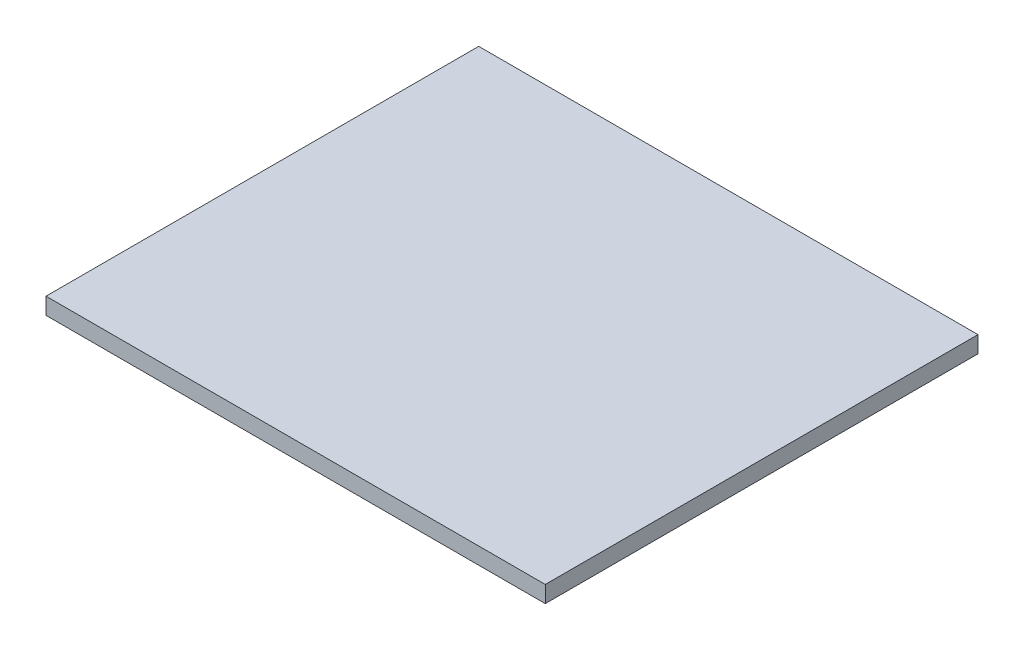
ISO-10303-21;
HEADER;
FILE_DESCRIPTION(('STEP AP214'),'2;1');
FILE_NAME('part.step','',(''),(''),'','','');
FILE_SCHEMA(('AUTOMOTIVE_DESIGN { 1 0 10303 214 1 1 1 1 }'));
ENDSEC;
DATA;
#1=APPLICATION_CONTEXT('core data for automotive mechanical design processes');
#2=APPLICATION_PROTOCOL_DEFINITION('international standard','automotive_design',2000,#1);
#3=PRODUCT_CONTEXT('',#1,'mechanical');
#4=PRODUCT('Part','Part','',(#3));
#5=PRODUCT_RELATED_PRODUCT_CATEGORY('part','',(#4));
#6=PRODUCT_DEFINITION_FORMATION('','',#4);
#7=PRODUCT_DEFINITION_CONTEXT('part definition',#1,'design');
#8=PRODUCT_DEFINITION('design','',#6,#7);
#9=PRODUCT_DEFINITION_SHAPE('','',#8);
#10=(LENGTH_UNIT() NAMED_UNIT(*) SI_UNIT(.MILLI.,.METRE.));
#11=(NAMED_UNIT(*) PLANE_ANGLE_UNIT() SI_UNIT($,.RADIAN.));
#12=(NAMED_UNIT(*) SI_UNIT($,.STERADIAN.) SOLID_ANGLE_UNIT());
#13=UNCERTAINTY_MEASURE_WITH_UNIT(LENGTH_MEASURE(1.E-05),#10,'distance_accuracy_value','');
#14=(GEOMETRIC_REPRESENTATION_CONTEXT(3) GLOBAL_UNCERTAINTY_ASSIGNED_CONTEXT((#13)) GLOBAL_UNIT_ASSIGNED_CONTEXT((#10,
#11,#12)) REPRESENTATION_CONTEXT('',''));
#15=CARTESIAN_POINT('',(0.,0.,0.));
#16=DIRECTION('',(0.,0.,1.));
#17=DIRECTION('',(1.,0.,0.));
#18=AXIS2_PLACEMENT_3D('',#15,#16,#17);
#19=CARTESIAN_POINT('',(15.,0.301665800295408,12.5242326148739));
#20=DIRECTION('',(0.,0.,-1.));
#21=DIRECTION('',(-1.,0.,0.));
#22=AXIS2_PLACEMENT_3D('',#19,#20,#21);
#23=PLANE('',#22);
#24=DIRECTION('',(0.,-1.,0.));
#25=VECTOR('',#24,1.);
#26=CARTESIAN_POINT('',(-15.,0.301665800295408,12.5242326148739));
#27=LINE('',#26,#25);
#28=CARTESIAN_POINT('',(-15.,1.30166580029541,12.5242326148739));
#29=VERTEX_POINT('',#28);
#30=CARTESIAN_POINT('',(-15.,0.301665800295408,12.5242326148739));
#31=VERTEX_POINT('',#30);
#32=EDGE_CURVE('E95',#29,#31,#27,.T.);
#33=ORIENTED_EDGE('',*,*,#32,.T.);
#34=DIRECTION('',(-1.,0.,0.));
#35=VECTOR('',#34,1.);
#36=CARTESIAN_POINT('',(15.,0.301665800295408,12.5242326148739));
#37=LINE('',#36,#35);
#38=CARTESIAN_POINT('',(15.,0.301665800295408,12.5242326148739));
#39=VERTEX_POINT('',#38);
#40=EDGE_CURVE('E11',#39,#31,#37,.T.);
#41=ORIENTED_EDGE('',*,*,#40,.F.);
#42=DIRECTION('',(0.,-1.,0.));
#43=VECTOR('',#42,1.);
#44=CARTESIAN_POINT('',(15.,0.301665800295408,12.5242326148739));
#45=LINE('',#44,#43);
#46=CARTESIAN_POINT('',(15.,1.30166580029541,12.5242326148739));
#47=VERTEX_POINT('',#46);
#48=EDGE_CURVE('E83',#47,#39,#45,.T.);
#49=ORIENTED_EDGE('',*,*,#48,.F.);
#50=DIRECTION('',(-1.,0.,0.));
#51=VECTOR('',#50,1.);
#52=CARTESIAN_POINT('',(15.,1.30166580029541,12.5242326148739));
#53=LINE('',#52,#51);
#54=EDGE_CURVE('E91',#47,#29,#53,.T.);
#55=ORIENTED_EDGE('',*,*,#54,.T.);
#56=EDGE_LOOP('',(#33,#41,#49,#55));
#57=FACE_BOUND('',#56,.T.);
#58=ADVANCED_FACE('F32',(#57),#23,.F.);
#59=CARTESIAN_POINT('',(15.,0.301665800295408,12.5242326148739));
#60=DIRECTION('',(0.,1.,0.));
#61=DIRECTION('',(0.,0.,1.));
#62=AXIS2_PLACEMENT_3D('',#59,#60,#61);
#63=PLANE('',#62);
#64=DIRECTION('',(0.,0.,-1.));
#65=VECTOR('',#64,1.);
#66=CARTESIAN_POINT('',(-15.,0.301665800295408,12.5242326148739));
#67=LINE('',#66,#65);
#68=CARTESIAN_POINT('',(-15.,0.301665800295408,-13.4757673851261));
#69=VERTEX_POINT('',#68);
#70=EDGE_CURVE('E87',#31,#69,#67,.T.);
#71=ORIENTED_EDGE('',*,*,#70,.T.);
#72=DIRECTION('',(-1.,0.,0.));
#73=VECTOR('',#72,1.);
#74=CARTESIAN_POINT('',(15.,0.301665800295408,-13.4757673851261));
#75=LINE('',#74,#73);
#76=CARTESIAN_POINT('',(15.,0.301665800295408,-13.4757673851261));
#77=VERTEX_POINT('',#76);
#78=EDGE_CURVE('E40',#77,#69,#75,.T.);
#79=ORIENTED_EDGE('',*,*,#78,.F.);
#80=DIRECTION('',(0.,0.,-1.));
#81=VECTOR('',#80,1.);
#82=CARTESIAN_POINT('',(15.,0.301665800295408,12.5242326148739));
#83=LINE('',#82,#81);
#84=EDGE_CURVE('E78',#39,#77,#83,.T.);
#85=ORIENTED_EDGE('',*,*,#84,.F.);
#86=ORIENTED_EDGE('',*,*,#40,.T.);
#87=EDGE_LOOP('',(#71,#79,#85,#86));
#88=FACE_BOUND('',#87,.T.);
#89=ADVANCED_FACE('F86',(#88),#63,.F.);
#90=CARTESIAN_POINT('',(15.,0.301665800295408,-13.4757673851261));
#91=DIRECTION('',(0.,0.,1.));
#92=DIRECTION('',(0.,-1.,0.));
#93=AXIS2_PLACEMENT_3D('',#90,#91,#92);
#94=PLANE('',#93);
#95=DIRECTION('',(0.,1.,0.));
#96=VECTOR('',#95,1.);
#97=CARTESIAN_POINT('',(-15.,0.301665800295408,-13.4757673851261));
#98=LINE('',#97,#96);
#99=CARTESIAN_POINT('',(-15.,1.30166580029541,-13.4757673851261));
#100=VERTEX_POINT('',#99);
#101=EDGE_CURVE('E65',#69,#100,#98,.T.);
#102=ORIENTED_EDGE('',*,*,#101,.T.);
#103=DIRECTION('',(-1.,0.,0.));
#104=VECTOR('',#103,1.);
#105=CARTESIAN_POINT('',(15.,1.30166580029541,-13.4757673851261));
#106=LINE('',#105,#104);
#107=CARTESIAN_POINT('',(15.,1.30166580029541,-13.4757673851261));
#108=VERTEX_POINT('',#107);
#109=EDGE_CURVE('E88',#108,#100,#106,.T.);
#110=ORIENTED_EDGE('',*,*,#109,.F.);
#111=DIRECTION('',(0.,1.,0.));
#112=VECTOR('',#111,1.);
#113=CARTESIAN_POINT('',(15.,0.301665800295408,-13.4757673851261));
#114=LINE('',#113,#112);
#115=EDGE_CURVE('E81',#77,#108,#114,.T.);
#116=ORIENTED_EDGE('',*,*,#115,.F.);
#117=ORIENTED_EDGE('',*,*,#78,.T.);
#118=EDGE_LOOP('',(#102,#110,#116,#117));
#119=FACE_BOUND('',#118,.T.);
#120=ADVANCED_FACE('F89',(#119),#94,.F.);
#121=CARTESIAN_POINT('',(15.,1.30166580029541,12.5242326148739));
#122=DIRECTION('',(0.,-1.,0.));
#123=DIRECTION('',(0.,0.,-1.));
#124=AXIS2_PLACEMENT_3D('',#121,#122,#123);
#125=PLANE('',#124);
#126=DIRECTION('',(0.,0.,1.));
#127=VECTOR('',#126,1.);
#128=CARTESIAN_POINT('',(-15.,1.30166580029541,12.5242326148739));
#129=LINE('',#128,#127);
#130=EDGE_CURVE('E71',#100,#29,#129,.T.);
#131=ORIENTED_EDGE('',*,*,#130,.T.);
#132=ORIENTED_EDGE('',*,*,#54,.F.);
#133=DIRECTION('',(0.,0.,1.));
#134=VECTOR('',#133,1.);
#135=CARTESIAN_POINT('',(15.,1.30166580029541,12.5242326148739));
#136=LINE('',#135,#134);
#137=EDGE_CURVE('E48',#108,#47,#136,.T.);
#138=ORIENTED_EDGE('',*,*,#137,.F.);
#139=ORIENTED_EDGE('',*,*,#109,.T.);
#140=EDGE_LOOP('',(#131,#132,#138,#139));
#141=FACE_BOUND('',#140,.T.);
#142=ADVANCED_FACE('F102',(#141),#125,.F.);
#143=CARTESIAN_POINT('',(15.,0.,0.));
#144=DIRECTION('',(-1.,0.,0.));
#145=DIRECTION('',(0.,0.,1.));
#146=AXIS2_PLACEMENT_3D('',#143,#144,#145);
#147=PLANE('',#146);
#148=ORIENTED_EDGE('',*,*,#48,.T.);
#149=ORIENTED_EDGE('',*,*,#84,.T.);
#150=ORIENTED_EDGE('',*,*,#115,.T.);
#151=ORIENTED_EDGE('',*,*,#137,.T.);
#152=EDGE_LOOP('',(#148,#149,#150,#151));
#153=FACE_BOUND('',#152,.T.);
#154=ADVANCED_FACE('F79',(#153),#147,.F.);
#155=CARTESIAN_POINT('',(-15.,0.,0.));
#156=DIRECTION('',(-1.,0.,0.));
#157=DIRECTION('',(0.,0.,1.));
#158=AXIS2_PLACEMENT_3D('',#155,#156,#157);
#159=PLANE('',#158);
#160=ORIENTED_EDGE('',*,*,#32,.F.);
#161=ORIENTED_EDGE('',*,*,#130,.F.);
#162=ORIENTED_EDGE('',*,*,#101,.F.);
#163=ORIENTED_EDGE('',*,*,#70,.F.);
#164=EDGE_LOOP('',(#160,#161,#162,#163));
#165=FACE_BOUND('',#164,.T.);
#166=ADVANCED_FACE('F105',(#165),#159,.T.);
#167=CLOSED_SHELL('',(#58,#89,#120,#142,#154,#166));
#168=MANIFOLD_SOLID_BREP('B2',#167);
#169=ADVANCED_BREP_SHAPE_REPRESENTATION('',(#18,#168),#14);
#170=SHAPE_DEFINITION_REPRESENTATION(#9,#169);
ENDSEC;
END-ISO-10303-21;
